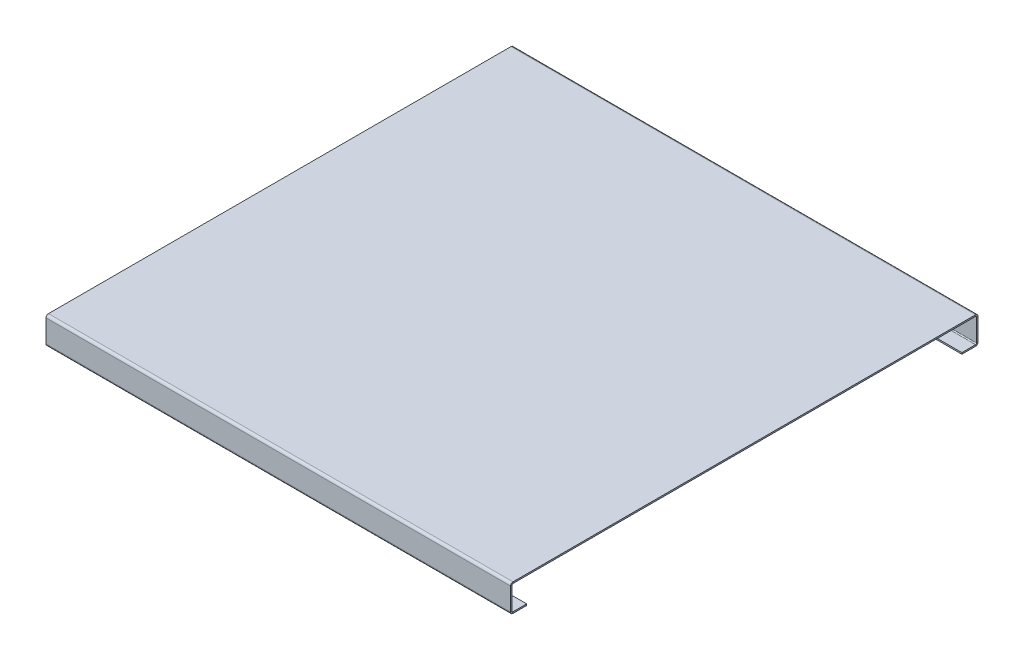
ISO-10303-21;
HEADER;
FILE_DESCRIPTION(('STEP AP214'),'2;1');
FILE_NAME('part.step','',(''),(''),'','','');
FILE_SCHEMA(('AUTOMOTIVE_DESIGN { 1 0 10303 214 1 1 1 1 }'));
ENDSEC;
DATA;
#1=APPLICATION_CONTEXT('core data for automotive mechanical design processes');
#2=APPLICATION_PROTOCOL_DEFINITION('international standard','automotive_design',2000,#1);
#3=PRODUCT_CONTEXT('',#1,'mechanical');
#4=PRODUCT('Part','Part','',(#3));
#5=PRODUCT_RELATED_PRODUCT_CATEGORY('part','',(#4));
#6=PRODUCT_DEFINITION_FORMATION('','',#4);
#7=PRODUCT_DEFINITION_CONTEXT('part definition',#1,'design');
#8=PRODUCT_DEFINITION('design','',#6,#7);
#9=PRODUCT_DEFINITION_SHAPE('','',#8);
#10=(LENGTH_UNIT() NAMED_UNIT(*) SI_UNIT(.MILLI.,.METRE.));
#11=(NAMED_UNIT(*) PLANE_ANGLE_UNIT() SI_UNIT($,.RADIAN.));
#12=(NAMED_UNIT(*) SI_UNIT($,.STERADIAN.) SOLID_ANGLE_UNIT());
#13=UNCERTAINTY_MEASURE_WITH_UNIT(LENGTH_MEASURE(1.E-05),#10,'distance_accuracy_value','');
#14=(GEOMETRIC_REPRESENTATION_CONTEXT(3) GLOBAL_UNCERTAINTY_ASSIGNED_CONTEXT((#13)) GLOBAL_UNIT_ASSIGNED_CONTEXT((#10,
#11,#12)) REPRESENTATION_CONTEXT('',''));
#15=CARTESIAN_POINT('',(0.,0.,0.));
#16=DIRECTION('',(0.,0.,1.));
#17=DIRECTION('',(1.,0.,0.));
#18=AXIS2_PLACEMENT_3D('',#15,#16,#17);
#19=CARTESIAN_POINT('',(950.,-48.,-950.));
#20=DIRECTION('',(1.,0.,0.));
#21=DIRECTION('',(0.,0.,-1.));
#22=AXIS2_PLACEMENT_3D('',#19,#20,#21);
#23=PLANE('',#22);
#24=DIRECTION('',(0.,0.,-1.));
#25=VECTOR('',#24,1.);
#26=CARTESIAN_POINT('',(950.,-48.,-950.));
#27=LINE('',#26,#25);
#28=CARTESIAN_POINT('',(950.,-48.,-950.));
#29=VERTEX_POINT('',#28);
#30=CARTESIAN_POINT('',(950.,-48.,-953.));
#31=VERTEX_POINT('',#30);
#32=EDGE_CURVE('E11',#29,#31,#27,.T.);
#33=ORIENTED_EDGE('',*,*,#32,.F.);
#34=CARTESIAN_POINT('',(950.,-48.,-948.));
#35=DIRECTION('',(-1.,0.,0.));
#36=DIRECTION('',(0.,0.,1.));
#37=AXIS2_PLACEMENT_3D('',#34,#35,#36);
#38=CIRCLE('',#37,2.);
#39=CARTESIAN_POINT('',(950.,-50.,-948.));
#40=VERTEX_POINT('',#39);
#41=EDGE_CURVE('E364',#40,#29,#38,.F.);
#42=ORIENTED_EDGE('',*,*,#41,.F.);
#43=DIRECTION('',(0.,1.,0.));
#44=VECTOR('',#43,1.);
#45=CARTESIAN_POINT('',(950.,-53.,-948.));
#46=LINE('',#45,#44);
#47=CARTESIAN_POINT('',(950.,-53.,-948.));
#48=VERTEX_POINT('',#47);
#49=EDGE_CURVE('E43',#48,#40,#46,.T.);
#50=ORIENTED_EDGE('',*,*,#49,.F.);
#51=CARTESIAN_POINT('',(950.,-48.,-948.));
#52=DIRECTION('',(1.,0.,0.));
#53=DIRECTION('',(0.,0.,-1.));
#54=AXIS2_PLACEMENT_3D('',#51,#52,#53);
#55=CIRCLE('',#54,5.);
#56=EDGE_CURVE('E377',#48,#31,#55,.T.);
#57=ORIENTED_EDGE('',*,*,#56,.T.);
#58=EDGE_LOOP('',(#33,#42,#50,#57));
#59=FACE_BOUND('',#58,.T.);
#60=ADVANCED_FACE('F35',(#59),#23,.T.);
#61=CARTESIAN_POINT('',(950.,-53.,-948.));
#62=DIRECTION('',(1.,0.,0.));
#63=DIRECTION('',(0.,0.,-1.));
#64=AXIS2_PLACEMENT_3D('',#61,#62,#63);
#65=PLANE('',#64);
#66=DIRECTION('',(0.,1.,0.));
#67=VECTOR('',#66,1.);
#68=CARTESIAN_POINT('',(950.,0.,-950.));
#69=LINE('',#68,#67);
#70=CARTESIAN_POINT('',(950.,-2.,-950.));
#71=VERTEX_POINT('',#70);
#72=EDGE_CURVE('E368',#29,#71,#69,.T.);
#73=ORIENTED_EDGE('',*,*,#72,.F.);
#74=ORIENTED_EDGE('',*,*,#32,.T.);
#75=DIRECTION('',(0.,1.,0.));
#76=VECTOR('',#75,1.);
#77=CARTESIAN_POINT('',(950.,0.,-953.));
#78=LINE('',#77,#76);
#79=CARTESIAN_POINT('',(950.,-2.,-953.));
#80=VERTEX_POINT('',#79);
#81=EDGE_CURVE('E379',#31,#80,#78,.T.);
#82=ORIENTED_EDGE('',*,*,#81,.T.);
#83=DIRECTION('',(0.,0.,1.));
#84=VECTOR('',#83,1.);
#85=CARTESIAN_POINT('',(950.,-2.,-953.));
#86=LINE('',#85,#84);
#87=EDGE_CURVE('E338',#80,#71,#86,.T.);
#88=ORIENTED_EDGE('',*,*,#87,.T.);
#89=EDGE_LOOP('',(#73,#74,#82,#88));
#90=FACE_BOUND('',#89,.T.);
#91=ADVANCED_FACE('F448',(#90),#65,.T.);
#92=CARTESIAN_POINT('',(0.,-50.,-948.));
#93=DIRECTION('',(-1.,0.,0.));
#94=DIRECTION('',(0.,0.,1.));
#95=AXIS2_PLACEMENT_3D('',#92,#93,#94);
#96=PLANE('',#95);
#97=DIRECTION('',(0.,-1.,0.));
#98=VECTOR('',#97,1.);
#99=CARTESIAN_POINT('',(0.,-50.,-948.));
#100=LINE('',#99,#98);
#101=CARTESIAN_POINT('',(0.,-50.,-948.));
#102=VERTEX_POINT('',#101);
#103=CARTESIAN_POINT('',(0.,-53.,-948.));
#104=VERTEX_POINT('',#103);
#105=EDGE_CURVE('E344',#102,#104,#100,.T.);
#106=ORIENTED_EDGE('',*,*,#105,.F.);
#107=CARTESIAN_POINT('',(0.,-48.,-948.));
#108=DIRECTION('',(-1.,0.,0.));
#109=DIRECTION('',(0.,0.,1.));
#110=AXIS2_PLACEMENT_3D('',#107,#108,#109);
#111=CIRCLE('',#110,2.);
#112=CARTESIAN_POINT('',(0.,-48.,-950.));
#113=VERTEX_POINT('',#112);
#114=EDGE_CURVE('E248',#102,#113,#111,.F.);
#115=ORIENTED_EDGE('',*,*,#114,.T.);
#116=DIRECTION('',(0.,0.,1.));
#117=VECTOR('',#116,1.);
#118=CARTESIAN_POINT('',(0.,-48.,-953.));
#119=LINE('',#118,#117);
#120=CARTESIAN_POINT('',(0.,-48.,-953.));
#121=VERTEX_POINT('',#120);
#122=EDGE_CURVE('E342',#121,#113,#119,.T.);
#123=ORIENTED_EDGE('',*,*,#122,.F.);
#124=CARTESIAN_POINT('',(0.,-48.,-948.));
#125=DIRECTION('',(1.,0.,0.));
#126=DIRECTION('',(0.,0.,-1.));
#127=AXIS2_PLACEMENT_3D('',#124,#125,#126);
#128=CIRCLE('',#127,5.);
#129=EDGE_CURVE('E260',#104,#121,#128,.T.);
#130=ORIENTED_EDGE('',*,*,#129,.F.);
#131=EDGE_LOOP('',(#106,#115,#123,#130));
#132=FACE_BOUND('',#131,.T.);
#133=ADVANCED_FACE('F490',(#132),#96,.T.);
#134=CARTESIAN_POINT('',(0.,-48.,-953.));
#135=DIRECTION('',(-1.,0.,0.));
#136=DIRECTION('',(0.,0.,1.));
#137=AXIS2_PLACEMENT_3D('',#134,#135,#136);
#138=PLANE('',#137);
#139=DIRECTION('',(0.,0.,-1.));
#140=VECTOR('',#139,1.);
#141=CARTESIAN_POINT('',(0.,-50.,-950.));
#142=LINE('',#141,#140);
#143=CARTESIAN_POINT('',(0.,-50.,-920.));
#144=VERTEX_POINT('',#143);
#145=EDGE_CURVE('E251',#144,#102,#142,.T.);
#146=ORIENTED_EDGE('',*,*,#145,.T.);
#147=ORIENTED_EDGE('',*,*,#105,.T.);
#148=DIRECTION('',(0.,0.,-1.));
#149=VECTOR('',#148,1.);
#150=CARTESIAN_POINT('',(0.,-53.,-950.));
#151=LINE('',#150,#149);
#152=CARTESIAN_POINT('',(0.,-53.,-920.));
#153=VERTEX_POINT('',#152);
#154=EDGE_CURVE('E257',#153,#104,#151,.T.);
#155=ORIENTED_EDGE('',*,*,#154,.F.);
#156=DIRECTION('',(0.,1.,0.));
#157=VECTOR('',#156,1.);
#158=CARTESIAN_POINT('',(0.,-53.,-920.));
#159=LINE('',#158,#157);
#160=EDGE_CURVE('E254',#153,#144,#159,.T.);
#161=ORIENTED_EDGE('',*,*,#160,.T.);
#162=EDGE_LOOP('',(#146,#147,#155,#161));
#163=FACE_BOUND('',#162,.T.);
#164=ADVANCED_FACE('F494',(#163),#138,.T.);
#165=CARTESIAN_POINT('',(950.,0.,-948.));
#166=DIRECTION('',(1.,0.,0.));
#167=DIRECTION('',(0.,0.,-1.));
#168=AXIS2_PLACEMENT_3D('',#165,#166,#167);
#169=PLANE('',#168);
#170=DIRECTION('',(0.,1.,0.));
#171=VECTOR('',#170,1.);
#172=CARTESIAN_POINT('',(950.,0.,-948.));
#173=LINE('',#172,#171);
#174=CARTESIAN_POINT('',(950.,0.,-948.));
#175=VERTEX_POINT('',#174);
#176=CARTESIAN_POINT('',(950.,3.,-948.));
#177=VERTEX_POINT('',#176);
#178=EDGE_CURVE('E340',#175,#177,#173,.T.);
#179=ORIENTED_EDGE('',*,*,#178,.F.);
#180=CARTESIAN_POINT('',(950.,-2.,-948.));
#181=DIRECTION('',(-1.,0.,0.));
#182=DIRECTION('',(0.,0.,1.));
#183=AXIS2_PLACEMENT_3D('',#180,#181,#182);
#184=CIRCLE('',#183,2.);
#185=EDGE_CURVE('E438',#71,#175,#184,.F.);
#186=ORIENTED_EDGE('',*,*,#185,.F.);
#187=ORIENTED_EDGE('',*,*,#87,.F.);
#188=CARTESIAN_POINT('',(950.,-2.,-948.));
#189=DIRECTION('',(1.,0.,0.));
#190=DIRECTION('',(0.,0.,-1.));
#191=AXIS2_PLACEMENT_3D('',#188,#189,#190);
#192=CIRCLE('',#191,5.);
#193=EDGE_CURVE('E382',#80,#177,#192,.T.);
#194=ORIENTED_EDGE('',*,*,#193,.T.);
#195=EDGE_LOOP('',(#179,#186,#187,#194));
#196=FACE_BOUND('',#195,.T.);
#197=ADVANCED_FACE('F455',(#196),#169,.T.);
#198=CARTESIAN_POINT('',(950.,-2.,-953.));
#199=DIRECTION('',(1.,0.,0.));
#200=DIRECTION('',(0.,0.,-1.));
#201=AXIS2_PLACEMENT_3D('',#198,#199,#200);
#202=PLANE('',#201);
#203=DIRECTION('',(0.,0.,1.));
#204=VECTOR('',#203,1.);
#205=CARTESIAN_POINT('',(950.,0.,0.));
#206=LINE('',#205,#204);
#207=CARTESIAN_POINT('',(950.,0.,-2.));
#208=VERTEX_POINT('',#207);
#209=EDGE_CURVE('E435',#175,#208,#206,.T.);
#210=ORIENTED_EDGE('',*,*,#209,.F.);
#211=ORIENTED_EDGE('',*,*,#178,.T.);
#212=DIRECTION('',(0.,0.,-1.));
#213=VECTOR('',#212,1.);
#214=CARTESIAN_POINT('',(950.,3.,0.));
#215=LINE('',#214,#213);
#216=CARTESIAN_POINT('',(950.,3.,-2.));
#217=VERTEX_POINT('',#216);
#218=EDGE_CURVE('E202',#177,#217,#215,.F.);
#219=ORIENTED_EDGE('',*,*,#218,.T.);
#220=DIRECTION('',(0.,-1.,0.));
#221=VECTOR('',#220,1.);
#222=CARTESIAN_POINT('',(950.,3.,-2.));
#223=LINE('',#222,#221);
#224=EDGE_CURVE('E193',#217,#208,#223,.T.);
#225=ORIENTED_EDGE('',*,*,#224,.T.);
#226=EDGE_LOOP('',(#210,#211,#219,#225));
#227=FACE_BOUND('',#226,.T.);
#228=ADVANCED_FACE('F388',(#227),#202,.T.);
#229=CARTESIAN_POINT('',(0.,-2.,-950.));
#230=DIRECTION('',(-1.,0.,0.));
#231=DIRECTION('',(0.,0.,1.));
#232=AXIS2_PLACEMENT_3D('',#229,#230,#231);
#233=PLANE('',#232);
#234=DIRECTION('',(0.,0.,-1.));
#235=VECTOR('',#234,1.);
#236=CARTESIAN_POINT('',(0.,-2.,-950.));
#237=LINE('',#236,#235);
#238=CARTESIAN_POINT('',(0.,-2.,-950.));
#239=VERTEX_POINT('',#238);
#240=CARTESIAN_POINT('',(0.,-2.,-953.));
#241=VERTEX_POINT('',#240);
#242=EDGE_CURVE('E336',#239,#241,#237,.T.);
#243=ORIENTED_EDGE('',*,*,#242,.F.);
#244=CARTESIAN_POINT('',(0.,-2.,-948.));
#245=DIRECTION('',(-1.,0.,0.));
#246=DIRECTION('',(0.,0.,1.));
#247=AXIS2_PLACEMENT_3D('',#244,#245,#246);
#248=CIRCLE('',#247,2.);
#249=CARTESIAN_POINT('',(0.,0.,-948.));
#250=VERTEX_POINT('',#249);
#251=EDGE_CURVE('E242',#239,#250,#248,.F.);
#252=ORIENTED_EDGE('',*,*,#251,.T.);
#253=DIRECTION('',(0.,-1.,0.));
#254=VECTOR('',#253,1.);
#255=CARTESIAN_POINT('',(0.,3.,-948.));
#256=LINE('',#255,#254);
#257=CARTESIAN_POINT('',(0.,3.,-948.));
#258=VERTEX_POINT('',#257);
#259=EDGE_CURVE('E192',#258,#250,#256,.T.);
#260=ORIENTED_EDGE('',*,*,#259,.F.);
#261=CARTESIAN_POINT('',(0.,-2.,-948.));
#262=DIRECTION('',(1.,0.,0.));
#263=DIRECTION('',(0.,0.,-1.));
#264=AXIS2_PLACEMENT_3D('',#261,#262,#263);
#265=CIRCLE('',#264,5.);
#266=EDGE_CURVE('E266',#241,#258,#265,.T.);
#267=ORIENTED_EDGE('',*,*,#266,.F.);
#268=EDGE_LOOP('',(#243,#252,#260,#267));
#269=FACE_BOUND('',#268,.T.);
#270=ADVANCED_FACE('F464',(#269),#233,.T.);
#271=CARTESIAN_POINT('',(0.,3.,-948.));
#272=DIRECTION('',(-1.,0.,0.));
#273=DIRECTION('',(0.,0.,1.));
#274=AXIS2_PLACEMENT_3D('',#271,#272,#273);
#275=PLANE('',#274);
#276=DIRECTION('',(0.,1.,0.));
#277=VECTOR('',#276,1.);
#278=CARTESIAN_POINT('',(0.,0.,-950.));
#279=LINE('',#278,#277);
#280=EDGE_CURVE('E245',#113,#239,#279,.T.);
#281=ORIENTED_EDGE('',*,*,#280,.T.);
#282=ORIENTED_EDGE('',*,*,#242,.T.);
#283=DIRECTION('',(0.,1.,0.));
#284=VECTOR('',#283,1.);
#285=CARTESIAN_POINT('',(0.,0.,-953.));
#286=LINE('',#285,#284);
#287=EDGE_CURVE('E263',#121,#241,#286,.T.);
#288=ORIENTED_EDGE('',*,*,#287,.F.);
#289=ORIENTED_EDGE('',*,*,#122,.T.);
#290=EDGE_LOOP('',(#281,#282,#288,#289));
#291=FACE_BOUND('',#290,.T.);
#292=ADVANCED_FACE('F468',(#291),#275,.T.);
#293=CARTESIAN_POINT('',(950.,-2.,0.));
#294=DIRECTION('',(1.,0.,0.));
#295=DIRECTION('',(0.,0.,-1.));
#296=AXIS2_PLACEMENT_3D('',#293,#294,#295);
#297=PLANE('',#296);
#298=DIRECTION('',(0.,0.,1.));
#299=VECTOR('',#298,1.);
#300=CARTESIAN_POINT('',(950.,-2.,0.));
#301=LINE('',#300,#299);
#302=CARTESIAN_POINT('',(950.,-2.,0.));
#303=VERTEX_POINT('',#302);
#304=CARTESIAN_POINT('',(950.,-2.,3.));
#305=VERTEX_POINT('',#304);
#306=EDGE_CURVE('E180',#303,#305,#301,.T.);
#307=ORIENTED_EDGE('',*,*,#306,.F.);
#308=CARTESIAN_POINT('',(950.,-2.,-2.));
#309=DIRECTION('',(-1.,0.,0.));
#310=DIRECTION('',(0.,0.,1.));
#311=AXIS2_PLACEMENT_3D('',#308,#309,#310);
#312=CIRCLE('',#311,2.);
#313=EDGE_CURVE('E400',#208,#303,#312,.F.);
#314=ORIENTED_EDGE('',*,*,#313,.F.);
#315=ORIENTED_EDGE('',*,*,#224,.F.);
#316=CARTESIAN_POINT('',(950.,-2.,-2.));
#317=DIRECTION('',(1.,0.,0.));
#318=DIRECTION('',(0.,0.,-1.));
#319=AXIS2_PLACEMENT_3D('',#316,#317,#318);
#320=CIRCLE('',#319,5.);
#321=EDGE_CURVE('E196',#217,#305,#320,.T.);
#322=ORIENTED_EDGE('',*,*,#321,.T.);
#323=EDGE_LOOP('',(#307,#314,#315,#322));
#324=FACE_BOUND('',#323,.T.);
#325=ADVANCED_FACE('F198',(#324),#297,.T.);
#326=CARTESIAN_POINT('',(950.,3.,-2.));
#327=DIRECTION('',(1.,0.,0.));
#328=DIRECTION('',(0.,0.,-1.));
#329=AXIS2_PLACEMENT_3D('',#326,#327,#328);
#330=PLANE('',#329);
#331=DIRECTION('',(0.,-1.,0.));
#332=VECTOR('',#331,1.);
#333=CARTESIAN_POINT('',(950.,0.,0.));
#334=LINE('',#333,#332);
#335=CARTESIAN_POINT('',(950.,-48.,0.));
#336=VERTEX_POINT('',#335);
#337=EDGE_CURVE('E187',#303,#336,#334,.T.);
#338=ORIENTED_EDGE('',*,*,#337,.F.);
#339=ORIENTED_EDGE('',*,*,#306,.T.);
#340=DIRECTION('',(0.,-1.,0.));
#341=VECTOR('',#340,1.);
#342=CARTESIAN_POINT('',(950.,0.,3.));
#343=LINE('',#342,#341);
#344=CARTESIAN_POINT('',(950.,-48.,2.99999999999999));
#345=VERTEX_POINT('',#344);
#346=EDGE_CURVE('E184',#305,#345,#343,.T.);
#347=ORIENTED_EDGE('',*,*,#346,.T.);
#348=DIRECTION('',(0.,0.,-1.));
#349=VECTOR('',#348,1.);
#350=CARTESIAN_POINT('',(950.,-48.,2.99999999999999));
#351=LINE('',#350,#349);
#352=EDGE_CURVE('E327',#345,#336,#351,.T.);
#353=ORIENTED_EDGE('',*,*,#352,.T.);
#354=EDGE_LOOP('',(#338,#339,#347,#353));
#355=FACE_BOUND('',#354,.T.);
#356=ADVANCED_FACE('F182',(#355),#330,.T.);
#357=CARTESIAN_POINT('',(0.,0.,-2.));
#358=DIRECTION('',(-1.,0.,0.));
#359=DIRECTION('',(0.,0.,1.));
#360=AXIS2_PLACEMENT_3D('',#357,#358,#359);
#361=PLANE('',#360);
#362=DIRECTION('',(0.,1.,0.));
#363=VECTOR('',#362,1.);
#364=CARTESIAN_POINT('',(0.,0.,-2.));
#365=LINE('',#364,#363);
#366=CARTESIAN_POINT('',(0.,0.,-2.));
#367=VERTEX_POINT('',#366);
#368=CARTESIAN_POINT('',(0.,3.,-2.));
#369=VERTEX_POINT('',#368);
#370=EDGE_CURVE('E332',#367,#369,#365,.T.);
#371=ORIENTED_EDGE('',*,*,#370,.F.);
#372=CARTESIAN_POINT('',(0.,-2.,-2.));
#373=DIRECTION('',(-1.,0.,0.));
#374=DIRECTION('',(0.,0.,1.));
#375=AXIS2_PLACEMENT_3D('',#372,#373,#374);
#376=CIRCLE('',#375,2.);
#377=CARTESIAN_POINT('',(0.,-2.,0.));
#378=VERTEX_POINT('',#377);
#379=EDGE_CURVE('E236',#367,#378,#376,.F.);
#380=ORIENTED_EDGE('',*,*,#379,.T.);
#381=DIRECTION('',(0.,0.,-1.));
#382=VECTOR('',#381,1.);
#383=CARTESIAN_POINT('',(0.,-2.,3.));
#384=LINE('',#383,#382);
#385=CARTESIAN_POINT('',(0.,-2.,3.));
#386=VERTEX_POINT('',#385);
#387=EDGE_CURVE('E330',#386,#378,#384,.T.);
#388=ORIENTED_EDGE('',*,*,#387,.F.);
#389=CARTESIAN_POINT('',(0.,-2.,-2.));
#390=DIRECTION('',(1.,0.,0.));
#391=DIRECTION('',(0.,0.,-1.));
#392=AXIS2_PLACEMENT_3D('',#389,#390,#391);
#393=CIRCLE('',#392,5.);
#394=EDGE_CURVE('E209',#369,#386,#393,.T.);
#395=ORIENTED_EDGE('',*,*,#394,.F.);
#396=EDGE_LOOP('',(#371,#380,#388,#395));
#397=FACE_BOUND('',#396,.T.);
#398=ADVANCED_FACE('F394',(#397),#361,.T.);
#399=CARTESIAN_POINT('',(0.,-2.,3.));
#400=DIRECTION('',(-1.,0.,0.));
#401=DIRECTION('',(0.,0.,1.));
#402=AXIS2_PLACEMENT_3D('',#399,#400,#401);
#403=PLANE('',#402);
#404=DIRECTION('',(0.,0.,1.));
#405=VECTOR('',#404,1.);
#406=CARTESIAN_POINT('',(0.,0.,0.));
#407=LINE('',#406,#405);
#408=EDGE_CURVE('E239',#250,#367,#407,.T.);
#409=ORIENTED_EDGE('',*,*,#408,.T.);
#410=ORIENTED_EDGE('',*,*,#370,.T.);
#411=DIRECTION('',(0.,0.,-1.));
#412=VECTOR('',#411,1.);
#413=CARTESIAN_POINT('',(0.,3.,0.));
#414=LINE('',#413,#412);
#415=EDGE_CURVE('E269',#258,#369,#414,.F.);
#416=ORIENTED_EDGE('',*,*,#415,.F.);
#417=ORIENTED_EDGE('',*,*,#259,.T.);
#418=EDGE_LOOP('',(#409,#410,#416,#417));
#419=FACE_BOUND('',#418,.T.);
#420=ADVANCED_FACE('F474',(#419),#403,.T.);
#421=CARTESIAN_POINT('',(950.,-50.,-2.00000000000001));
#422=DIRECTION('',(1.,0.,0.));
#423=DIRECTION('',(0.,0.,-1.));
#424=AXIS2_PLACEMENT_3D('',#421,#422,#423);
#425=PLANE('',#424);
#426=DIRECTION('',(0.,-1.,0.));
#427=VECTOR('',#426,1.);
#428=CARTESIAN_POINT('',(950.,-50.,-2.00000000000001));
#429=LINE('',#428,#427);
#430=CARTESIAN_POINT('',(950.,-50.,-2.00000000000001));
#431=VERTEX_POINT('',#430);
#432=CARTESIAN_POINT('',(950.,-53.,-2.00000000000001));
#433=VERTEX_POINT('',#432);
#434=EDGE_CURVE('E51',#431,#433,#429,.T.);
#435=ORIENTED_EDGE('',*,*,#434,.F.);
#436=CARTESIAN_POINT('',(950.,-48.,-2.00000000000001));
#437=DIRECTION('',(-1.,0.,0.));
#438=DIRECTION('',(0.,0.,1.));
#439=AXIS2_PLACEMENT_3D('',#436,#437,#438);
#440=CIRCLE('',#439,2.);
#441=EDGE_CURVE('E428',#336,#431,#440,.F.);
#442=ORIENTED_EDGE('',*,*,#441,.F.);
#443=ORIENTED_EDGE('',*,*,#352,.F.);
#444=CARTESIAN_POINT('',(950.,-48.,-2.00000000000001));
#445=DIRECTION('',(1.,0.,0.));
#446=DIRECTION('',(0.,0.,-1.));
#447=AXIS2_PLACEMENT_3D('',#444,#445,#446);
#448=CIRCLE('',#447,5.);
#449=EDGE_CURVE('E217',#345,#433,#448,.T.);
#450=ORIENTED_EDGE('',*,*,#449,.T.);
#451=EDGE_LOOP('',(#435,#442,#443,#450));
#452=FACE_BOUND('',#451,.T.);
#453=ADVANCED_FACE('F476',(#452),#425,.T.);
#454=CARTESIAN_POINT('',(950.,-48.,2.99999999999999));
#455=DIRECTION('',(1.,0.,0.));
#456=DIRECTION('',(0.,0.,-1.));
#457=AXIS2_PLACEMENT_3D('',#454,#455,#456);
#458=PLANE('',#457);
#459=DIRECTION('',(0.,0.,-1.));
#460=VECTOR('',#459,1.);
#461=CARTESIAN_POINT('',(950.,-50.,0.));
#462=LINE('',#461,#460);
#463=CARTESIAN_POINT('',(950.,-50.,-30.));
#464=VERTEX_POINT('',#463);
#465=EDGE_CURVE('E426',#431,#464,#462,.T.);
#466=ORIENTED_EDGE('',*,*,#465,.F.);
#467=ORIENTED_EDGE('',*,*,#434,.T.);
#468=DIRECTION('',(0.,0.,-1.));
#469=VECTOR('',#468,1.);
#470=CARTESIAN_POINT('',(950.,-53.,0.));
#471=LINE('',#470,#469);
#472=CARTESIAN_POINT('',(950.,-53.,-30.));
#473=VERTEX_POINT('',#472);
#474=EDGE_CURVE('E129',#433,#473,#471,.T.);
#475=ORIENTED_EDGE('',*,*,#474,.T.);
#476=DIRECTION('',(0.,-1.,0.));
#477=VECTOR('',#476,1.);
#478=CARTESIAN_POINT('',(950.,-50.,-30.));
#479=LINE('',#478,#477);
#480=EDGE_CURVE('E424',#464,#473,#479,.T.);
#481=ORIENTED_EDGE('',*,*,#480,.F.);
#482=EDGE_LOOP('',(#466,#467,#475,#481));
#483=FACE_BOUND('',#482,.T.);
#484=ADVANCED_FACE('F482',(#483),#458,.T.);
#485=CARTESIAN_POINT('',(0.,-48.,0.));
#486=DIRECTION('',(-1.,0.,0.));
#487=DIRECTION('',(0.,0.,1.));
#488=AXIS2_PLACEMENT_3D('',#485,#486,#487);
#489=PLANE('',#488);
#490=DIRECTION('',(0.,0.,1.));
#491=VECTOR('',#490,1.);
#492=CARTESIAN_POINT('',(0.,-48.,0.));
#493=LINE('',#492,#491);
#494=CARTESIAN_POINT('',(0.,-48.,0.));
#495=VERTEX_POINT('',#494);
#496=CARTESIAN_POINT('',(0.,-48.,2.99999999999999));
#497=VERTEX_POINT('',#496);
#498=EDGE_CURVE('E116',#495,#497,#493,.T.);
#499=ORIENTED_EDGE('',*,*,#498,.F.);
#500=CARTESIAN_POINT('',(0.,-48.,-2.00000000000001));
#501=DIRECTION('',(-1.,0.,0.));
#502=DIRECTION('',(0.,0.,1.));
#503=AXIS2_PLACEMENT_3D('',#500,#501,#502);
#504=CIRCLE('',#503,2.);
#505=CARTESIAN_POINT('',(0.,-50.,-2.00000000000001));
#506=VERTEX_POINT('',#505);
#507=EDGE_CURVE('E232',#495,#506,#504,.F.);
#508=ORIENTED_EDGE('',*,*,#507,.T.);
#509=DIRECTION('',(0.,1.,0.));
#510=VECTOR('',#509,1.);
#511=CARTESIAN_POINT('',(0.,-53.,-2.00000000000001));
#512=LINE('',#511,#510);
#513=CARTESIAN_POINT('',(0.,-53.,-2.00000000000001));
#514=VERTEX_POINT('',#513);
#515=EDGE_CURVE('E123',#514,#506,#512,.T.);
#516=ORIENTED_EDGE('',*,*,#515,.F.);
#517=CARTESIAN_POINT('',(0.,-48.,-2.00000000000001));
#518=DIRECTION('',(1.,0.,0.));
#519=DIRECTION('',(0.,0.,-1.));
#520=AXIS2_PLACEMENT_3D('',#517,#518,#519);
#521=CIRCLE('',#520,5.);
#522=EDGE_CURVE('E275',#497,#514,#521,.T.);
#523=ORIENTED_EDGE('',*,*,#522,.F.);
#524=EDGE_LOOP('',(#499,#508,#516,#523));
#525=FACE_BOUND('',#524,.T.);
#526=ADVANCED_FACE('F411',(#525),#489,.T.);
#527=CARTESIAN_POINT('',(0.,-53.,-2.00000000000001));
#528=DIRECTION('',(-1.,0.,0.));
#529=DIRECTION('',(0.,0.,1.));
#530=AXIS2_PLACEMENT_3D('',#527,#528,#529);
#531=PLANE('',#530);
#532=DIRECTION('',(0.,-1.,0.));
#533=VECTOR('',#532,1.);
#534=CARTESIAN_POINT('',(0.,0.,0.));
#535=LINE('',#534,#533);
#536=EDGE_CURVE('E234',#378,#495,#535,.T.);
#537=ORIENTED_EDGE('',*,*,#536,.T.);
#538=ORIENTED_EDGE('',*,*,#498,.T.);
#539=DIRECTION('',(0.,-1.,0.));
#540=VECTOR('',#539,1.);
#541=CARTESIAN_POINT('',(0.,0.,3.));
#542=LINE('',#541,#540);
#543=EDGE_CURVE('E273',#386,#497,#542,.T.);
#544=ORIENTED_EDGE('',*,*,#543,.F.);
#545=ORIENTED_EDGE('',*,*,#387,.T.);
#546=EDGE_LOOP('',(#537,#538,#544,#545));
#547=FACE_BOUND('',#546,.T.);
#548=ADVANCED_FACE('F396',(#547),#531,.T.);
#549=CARTESIAN_POINT('',(950.,-53.,0.));
#550=DIRECTION('',(0.,1.,0.));
#551=DIRECTION('',(0.,0.,1.));
#552=AXIS2_PLACEMENT_3D('',#549,#550,#551);
#553=PLANE('',#552);
#554=DIRECTION('',(0.,0.,-1.));
#555=VECTOR('',#554,1.);
#556=CARTESIAN_POINT('',(0.,-53.,0.));
#557=LINE('',#556,#555);
#558=CARTESIAN_POINT('',(0.,-53.,-30.));
#559=VERTEX_POINT('',#558);
#560=EDGE_CURVE('E223',#514,#559,#557,.T.);
#561=ORIENTED_EDGE('',*,*,#560,.T.);
#562=DIRECTION('',(-1.,0.,0.));
#563=VECTOR('',#562,1.);
#564=CARTESIAN_POINT('',(950.,-53.,-30.));
#565=LINE('',#564,#563);
#566=EDGE_CURVE('E323',#473,#559,#565,.T.);
#567=ORIENTED_EDGE('',*,*,#566,.F.);
#568=ORIENTED_EDGE('',*,*,#474,.F.);
#569=DIRECTION('',(-1.,0.,0.));
#570=VECTOR('',#569,1.);
#571=CARTESIAN_POINT('',(950.,-53.,-2.00000000000001));
#572=LINE('',#571,#570);
#573=EDGE_CURVE('E219',#433,#514,#572,.T.);
#574=ORIENTED_EDGE('',*,*,#573,.T.);
#575=EDGE_LOOP('',(#561,#567,#568,#574));
#576=FACE_BOUND('',#575,.T.);
#577=ADVANCED_FACE('F417',(#576),#553,.F.);
#578=CARTESIAN_POINT('',(950.,-50.,-30.));
#579=DIRECTION('',(0.,0.,-1.));
#580=DIRECTION('',(-1.,0.,0.));
#581=AXIS2_PLACEMENT_3D('',#578,#579,#580);
#582=PLANE('',#581);
#583=DIRECTION('',(0.,-1.,0.));
#584=VECTOR('',#583,1.);
#585=CARTESIAN_POINT('',(0.,-50.,-30.));
#586=LINE('',#585,#584);
#587=CARTESIAN_POINT('',(0.,-50.,-30.));
#588=VERTEX_POINT('',#587);
#589=EDGE_CURVE('E226',#588,#559,#586,.T.);
#590=ORIENTED_EDGE('',*,*,#589,.F.);
#591=DIRECTION('',(-1.,0.,0.));
#592=VECTOR('',#591,1.);
#593=CARTESIAN_POINT('',(950.,-50.,-30.));
#594=LINE('',#593,#592);
#595=EDGE_CURVE('E321',#464,#588,#594,.T.);
#596=ORIENTED_EDGE('',*,*,#595,.F.);
#597=ORIENTED_EDGE('',*,*,#480,.T.);
#598=ORIENTED_EDGE('',*,*,#566,.T.);
#599=EDGE_LOOP('',(#590,#596,#597,#598));
#600=FACE_BOUND('',#599,.T.);
#601=ADVANCED_FACE('F422',(#600),#582,.T.);
#602=CARTESIAN_POINT('',(950.,-50.,0.));
#603=DIRECTION('',(0.,1.,0.));
#604=DIRECTION('',(0.,0.,1.));
#605=AXIS2_PLACEMENT_3D('',#602,#603,#604);
#606=PLANE('',#605);
#607=DIRECTION('',(0.,0.,-1.));
#608=VECTOR('',#607,1.);
#609=CARTESIAN_POINT('',(0.,-50.,0.));
#610=LINE('',#609,#608);
#611=EDGE_CURVE('E229',#506,#588,#610,.T.);
#612=ORIENTED_EDGE('',*,*,#611,.F.);
#613=DIRECTION('',(-1.,0.,0.));
#614=VECTOR('',#613,1.);
#615=CARTESIAN_POINT('',(950.,-50.,-2.00000000000001));
#616=LINE('',#615,#614);
#617=EDGE_CURVE('E318',#431,#506,#616,.T.);
#618=ORIENTED_EDGE('',*,*,#617,.F.);
#619=ORIENTED_EDGE('',*,*,#465,.T.);
#620=ORIENTED_EDGE('',*,*,#595,.T.);
#621=EDGE_LOOP('',(#612,#618,#619,#620));
#622=FACE_BOUND('',#621,.T.);
#623=ADVANCED_FACE('F578',(#622),#606,.T.);
#624=CARTESIAN_POINT('',(950.,-48.,-2.00000000000001));
#625=DIRECTION('',(-1.,0.,0.));
#626=DIRECTION('',(0.,0.,1.));
#627=AXIS2_PLACEMENT_3D('',#624,#625,#626);
#628=CYLINDRICAL_SURFACE('',#627,2.);
#629=ORIENTED_EDGE('',*,*,#507,.F.);
#630=DIRECTION('',(-1.,0.,0.));
#631=VECTOR('',#630,1.);
#632=CARTESIAN_POINT('',(950.,-48.,0.));
#633=LINE('',#632,#631);
#634=EDGE_CURVE('E315',#336,#495,#633,.T.);
#635=ORIENTED_EDGE('',*,*,#634,.F.);
#636=ORIENTED_EDGE('',*,*,#441,.T.);
#637=ORIENTED_EDGE('',*,*,#617,.T.);
#638=EDGE_LOOP('',(#629,#635,#636,#637));
#639=FACE_BOUND('',#638,.T.);
#640=ADVANCED_FACE('F408',(#639),#628,.F.);
#641=CARTESIAN_POINT('',(950.,0.,0.));
#642=DIRECTION('',(0.,0.,-1.));
#643=DIRECTION('',(0.,1.,0.));
#644=AXIS2_PLACEMENT_3D('',#641,#642,#643);
#645=PLANE('',#644);
#646=ORIENTED_EDGE('',*,*,#536,.F.);
#647=DIRECTION('',(-1.,0.,0.));
#648=VECTOR('',#647,1.);
#649=CARTESIAN_POINT('',(950.,-2.,0.));
#650=LINE('',#649,#648);
#651=EDGE_CURVE('E312',#303,#378,#650,.T.);
#652=ORIENTED_EDGE('',*,*,#651,.F.);
#653=ORIENTED_EDGE('',*,*,#337,.T.);
#654=ORIENTED_EDGE('',*,*,#634,.T.);
#655=EDGE_LOOP('',(#646,#652,#653,#654));
#656=FACE_BOUND('',#655,.T.);
#657=ADVANCED_FACE('F402',(#656),#645,.T.);
#658=CARTESIAN_POINT('',(950.,-2.,-2.));
#659=DIRECTION('',(-1.,0.,0.));
#660=DIRECTION('',(0.,0.,1.));
#661=AXIS2_PLACEMENT_3D('',#658,#659,#660);
#662=CYLINDRICAL_SURFACE('',#661,2.);
#663=ORIENTED_EDGE('',*,*,#379,.F.);
#664=DIRECTION('',(-1.,0.,0.));
#665=VECTOR('',#664,1.);
#666=CARTESIAN_POINT('',(950.,0.,-2.));
#667=LINE('',#666,#665);
#668=EDGE_CURVE('E309',#208,#367,#667,.T.);
#669=ORIENTED_EDGE('',*,*,#668,.F.);
#670=ORIENTED_EDGE('',*,*,#313,.T.);
#671=ORIENTED_EDGE('',*,*,#651,.T.);
#672=EDGE_LOOP('',(#663,#669,#670,#671));
#673=FACE_BOUND('',#672,.T.);
#674=ADVANCED_FACE('F399',(#673),#662,.F.);
#675=CARTESIAN_POINT('',(950.,0.,0.));
#676=DIRECTION('',(0.,-1.,0.));
#677=DIRECTION('',(0.,0.,-1.));
#678=AXIS2_PLACEMENT_3D('',#675,#676,#677);
#679=PLANE('',#678);
#680=ORIENTED_EDGE('',*,*,#408,.F.);
#681=DIRECTION('',(-1.,0.,0.));
#682=VECTOR('',#681,1.);
#683=CARTESIAN_POINT('',(950.,0.,-948.));
#684=LINE('',#683,#682);
#685=EDGE_CURVE('E306',#175,#250,#684,.T.);
#686=ORIENTED_EDGE('',*,*,#685,.F.);
#687=ORIENTED_EDGE('',*,*,#209,.T.);
#688=ORIENTED_EDGE('',*,*,#668,.T.);
#689=EDGE_LOOP('',(#680,#686,#687,#688));
#690=FACE_BOUND('',#689,.T.);
#691=ADVANCED_FACE('F461',(#690),#679,.T.);
#692=CARTESIAN_POINT('',(950.,-2.,-948.));
#693=DIRECTION('',(-1.,0.,0.));
#694=DIRECTION('',(0.,0.,1.));
#695=AXIS2_PLACEMENT_3D('',#692,#693,#694);
#696=CYLINDRICAL_SURFACE('',#695,2.);
#697=ORIENTED_EDGE('',*,*,#251,.F.);
#698=DIRECTION('',(-1.,0.,0.));
#699=VECTOR('',#698,1.);
#700=CARTESIAN_POINT('',(950.,-2.,-950.));
#701=LINE('',#700,#699);
#702=EDGE_CURVE('E303',#71,#239,#701,.T.);
#703=ORIENTED_EDGE('',*,*,#702,.F.);
#704=ORIENTED_EDGE('',*,*,#185,.T.);
#705=ORIENTED_EDGE('',*,*,#685,.T.);
#706=EDGE_LOOP('',(#697,#703,#704,#705));
#707=FACE_BOUND('',#706,.T.);
#708=ADVANCED_FACE('F454',(#707),#696,.F.);
#709=CARTESIAN_POINT('',(950.,0.,-950.));
#710=DIRECTION('',(0.,0.,1.));
#711=DIRECTION('',(1.,0.,0.));
#712=AXIS2_PLACEMENT_3D('',#709,#710,#711);
#713=PLANE('',#712);
#714=ORIENTED_EDGE('',*,*,#280,.F.);
#715=DIRECTION('',(-1.,0.,0.));
#716=VECTOR('',#715,1.);
#717=CARTESIAN_POINT('',(950.,-48.,-950.));
#718=LINE('',#717,#716);
#719=EDGE_CURVE('E300',#29,#113,#718,.T.);
#720=ORIENTED_EDGE('',*,*,#719,.F.);
#721=ORIENTED_EDGE('',*,*,#72,.T.);
#722=ORIENTED_EDGE('',*,*,#702,.T.);
#723=EDGE_LOOP('',(#714,#720,#721,#722));
#724=FACE_BOUND('',#723,.T.);
#725=ADVANCED_FACE('F444',(#724),#713,.T.);
#726=CARTESIAN_POINT('',(950.,-48.,-948.));
#727=DIRECTION('',(-1.,0.,0.));
#728=DIRECTION('',(0.,0.,1.));
#729=AXIS2_PLACEMENT_3D('',#726,#727,#728);
#730=CYLINDRICAL_SURFACE('',#729,2.);
#731=ORIENTED_EDGE('',*,*,#114,.F.);
#732=DIRECTION('',(-1.,0.,0.));
#733=VECTOR('',#732,1.);
#734=CARTESIAN_POINT('',(950.,-50.,-948.));
#735=LINE('',#734,#733);
#736=EDGE_CURVE('E297',#40,#102,#735,.T.);
#737=ORIENTED_EDGE('',*,*,#736,.F.);
#738=ORIENTED_EDGE('',*,*,#41,.T.);
#739=ORIENTED_EDGE('',*,*,#719,.T.);
#740=EDGE_LOOP('',(#731,#737,#738,#739));
#741=FACE_BOUND('',#740,.T.);
#742=ADVANCED_FACE('F363',(#741),#730,.F.);
#743=CARTESIAN_POINT('',(950.,-50.,-950.));
#744=DIRECTION('',(0.,1.,0.));
#745=DIRECTION('',(0.,0.,1.));
#746=AXIS2_PLACEMENT_3D('',#743,#744,#745);
#747=PLANE('',#746);
#748=ORIENTED_EDGE('',*,*,#145,.F.);
#749=DIRECTION('',(-1.,0.,0.));
#750=VECTOR('',#749,1.);
#751=CARTESIAN_POINT('',(950.,-50.,-920.));
#752=LINE('',#751,#750);
#753=CARTESIAN_POINT('',(950.,-50.,-920.));
#754=VERTEX_POINT('',#753);
#755=EDGE_CURVE('E295',#754,#144,#752,.T.);
#756=ORIENTED_EDGE('',*,*,#755,.F.);
#757=DIRECTION('',(0.,0.,-1.));
#758=VECTOR('',#757,1.);
#759=CARTESIAN_POINT('',(950.,-50.,-950.));
#760=LINE('',#759,#758);
#761=EDGE_CURVE('E352',#754,#40,#760,.T.);
#762=ORIENTED_EDGE('',*,*,#761,.T.);
#763=ORIENTED_EDGE('',*,*,#736,.T.);
#764=EDGE_LOOP('',(#748,#756,#762,#763));
#765=FACE_BOUND('',#764,.T.);
#766=ADVANCED_FACE('F370',(#765),#747,.T.);
#767=CARTESIAN_POINT('',(950.,-53.,-920.));
#768=DIRECTION('',(0.,0.,1.));
#769=DIRECTION('',(1.,0.,0.));
#770=AXIS2_PLACEMENT_3D('',#767,#768,#769);
#771=PLANE('',#770);
#772=ORIENTED_EDGE('',*,*,#160,.F.);
#773=DIRECTION('',(-1.,0.,0.));
#774=VECTOR('',#773,1.);
#775=CARTESIAN_POINT('',(950.,-53.,-920.));
#776=LINE('',#775,#774);
#777=CARTESIAN_POINT('',(950.,-53.,-920.));
#778=VERTEX_POINT('',#777);
#779=EDGE_CURVE('E293',#778,#153,#776,.T.);
#780=ORIENTED_EDGE('',*,*,#779,.F.);
#781=DIRECTION('',(0.,1.,0.));
#782=VECTOR('',#781,1.);
#783=CARTESIAN_POINT('',(950.,-53.,-920.));
#784=LINE('',#783,#782);
#785=EDGE_CURVE('E371',#778,#754,#784,.T.);
#786=ORIENTED_EDGE('',*,*,#785,.T.);
#787=ORIENTED_EDGE('',*,*,#755,.T.);
#788=EDGE_LOOP('',(#772,#780,#786,#787));
#789=FACE_BOUND('',#788,.T.);
#790=ADVANCED_FACE('F661',(#789),#771,.T.);
#791=CARTESIAN_POINT('',(950.,-53.,-950.));
#792=DIRECTION('',(0.,1.,0.));
#793=DIRECTION('',(0.,0.,1.));
#794=AXIS2_PLACEMENT_3D('',#791,#792,#793);
#795=PLANE('',#794);
#796=ORIENTED_EDGE('',*,*,#154,.T.);
#797=DIRECTION('',(-1.,0.,0.));
#798=VECTOR('',#797,1.);
#799=CARTESIAN_POINT('',(950.,-53.,-948.));
#800=LINE('',#799,#798);
#801=EDGE_CURVE('E290',#48,#104,#800,.T.);
#802=ORIENTED_EDGE('',*,*,#801,.F.);
#803=DIRECTION('',(0.,0.,-1.));
#804=VECTOR('',#803,1.);
#805=CARTESIAN_POINT('',(950.,-53.,-950.));
#806=LINE('',#805,#804);
#807=EDGE_CURVE('E355',#778,#48,#806,.T.);
#808=ORIENTED_EDGE('',*,*,#807,.F.);
#809=ORIENTED_EDGE('',*,*,#779,.T.);
#810=EDGE_LOOP('',(#796,#802,#808,#809));
#811=FACE_BOUND('',#810,.T.);
#812=ADVANCED_FACE('F671',(#811),#795,.F.);
#813=CARTESIAN_POINT('',(950.,-48.,-948.));
#814=DIRECTION('',(-1.,0.,0.));
#815=DIRECTION('',(0.,0.,1.));
#816=AXIS2_PLACEMENT_3D('',#813,#814,#815);
#817=CYLINDRICAL_SURFACE('',#816,5.);
#818=ORIENTED_EDGE('',*,*,#129,.T.);
#819=DIRECTION('',(-1.,0.,0.));
#820=VECTOR('',#819,1.);
#821=CARTESIAN_POINT('',(950.,-48.,-953.));
#822=LINE('',#821,#820);
#823=EDGE_CURVE('E287',#31,#121,#822,.T.);
#824=ORIENTED_EDGE('',*,*,#823,.F.);
#825=ORIENTED_EDGE('',*,*,#56,.F.);
#826=ORIENTED_EDGE('',*,*,#801,.T.);
#827=EDGE_LOOP('',(#818,#824,#825,#826));
#828=FACE_BOUND('',#827,.T.);
#829=ADVANCED_FACE('F682',(#828),#817,.T.);
#830=CARTESIAN_POINT('',(950.,0.,-953.));
#831=DIRECTION('',(0.,0.,1.));
#832=DIRECTION('',(1.,0.,0.));
#833=AXIS2_PLACEMENT_3D('',#830,#831,#832);
#834=PLANE('',#833);
#835=ORIENTED_EDGE('',*,*,#287,.T.);
#836=DIRECTION('',(-1.,0.,0.));
#837=VECTOR('',#836,1.);
#838=CARTESIAN_POINT('',(950.,-2.,-953.));
#839=LINE('',#838,#837);
#840=EDGE_CURVE('E284',#80,#241,#839,.T.);
#841=ORIENTED_EDGE('',*,*,#840,.F.);
#842=ORIENTED_EDGE('',*,*,#81,.F.);
#843=ORIENTED_EDGE('',*,*,#823,.T.);
#844=EDGE_LOOP('',(#835,#841,#842,#843));
#845=FACE_BOUND('',#844,.T.);
#846=ADVANCED_FACE('F470',(#845),#834,.F.);
#847=CARTESIAN_POINT('',(950.,-2.,-948.));
#848=DIRECTION('',(-1.,0.,0.));
#849=DIRECTION('',(0.,0.,1.));
#850=AXIS2_PLACEMENT_3D('',#847,#848,#849);
#851=CYLINDRICAL_SURFACE('',#850,5.);
#852=ORIENTED_EDGE('',*,*,#266,.T.);
#853=DIRECTION('',(-1.,0.,0.));
#854=VECTOR('',#853,1.);
#855=CARTESIAN_POINT('',(950.,3.,-948.));
#856=LINE('',#855,#854);
#857=EDGE_CURVE('E281',#177,#258,#856,.T.);
#858=ORIENTED_EDGE('',*,*,#857,.F.);
#859=ORIENTED_EDGE('',*,*,#193,.F.);
#860=ORIENTED_EDGE('',*,*,#840,.T.);
#861=EDGE_LOOP('',(#852,#858,#859,#860));
#862=FACE_BOUND('',#861,.T.);
#863=ADVANCED_FACE('F473',(#862),#851,.T.);
#864=CARTESIAN_POINT('',(950.,3.,0.));
#865=DIRECTION('',(0.,-1.,0.));
#866=DIRECTION('',(0.,0.,-1.));
#867=AXIS2_PLACEMENT_3D('',#864,#865,#866);
#868=PLANE('',#867);
#869=ORIENTED_EDGE('',*,*,#415,.T.);
#870=DIRECTION('',(-1.,0.,0.));
#871=VECTOR('',#870,1.);
#872=CARTESIAN_POINT('',(950.,3.,-2.));
#873=LINE('',#872,#871);
#874=EDGE_CURVE('E211',#217,#369,#873,.T.);
#875=ORIENTED_EDGE('',*,*,#874,.F.);
#876=ORIENTED_EDGE('',*,*,#218,.F.);
#877=ORIENTED_EDGE('',*,*,#857,.T.);
#878=EDGE_LOOP('',(#869,#875,#876,#877));
#879=FACE_BOUND('',#878,.T.);
#880=ADVANCED_FACE('F391',(#879),#868,.F.);
#881=CARTESIAN_POINT('',(950.,-2.,-2.));
#882=DIRECTION('',(-1.,0.,0.));
#883=DIRECTION('',(0.,0.,1.));
#884=AXIS2_PLACEMENT_3D('',#881,#882,#883);
#885=CYLINDRICAL_SURFACE('',#884,5.);
#886=ORIENTED_EDGE('',*,*,#394,.T.);
#887=DIRECTION('',(-1.,0.,0.));
#888=VECTOR('',#887,1.);
#889=CARTESIAN_POINT('',(950.,-2.,3.));
#890=LINE('',#889,#888);
#891=EDGE_CURVE('E206',#305,#386,#890,.T.);
#892=ORIENTED_EDGE('',*,*,#891,.F.);
#893=ORIENTED_EDGE('',*,*,#321,.F.);
#894=ORIENTED_EDGE('',*,*,#874,.T.);
#895=EDGE_LOOP('',(#886,#892,#893,#894));
#896=FACE_BOUND('',#895,.T.);
#897=ADVANCED_FACE('F207',(#896),#885,.T.);
#898=CARTESIAN_POINT('',(950.,0.,3.));
#899=DIRECTION('',(0.,0.,-1.));
#900=DIRECTION('',(0.,1.,0.));
#901=AXIS2_PLACEMENT_3D('',#898,#899,#900);
#902=PLANE('',#901);
#903=ORIENTED_EDGE('',*,*,#543,.T.);
#904=DIRECTION('',(-1.,0.,0.));
#905=VECTOR('',#904,1.);
#906=CARTESIAN_POINT('',(950.,-48.,2.99999999999999));
#907=LINE('',#906,#905);
#908=EDGE_CURVE('E212',#345,#497,#907,.T.);
#909=ORIENTED_EDGE('',*,*,#908,.F.);
#910=ORIENTED_EDGE('',*,*,#346,.F.);
#911=ORIENTED_EDGE('',*,*,#891,.T.);
#912=EDGE_LOOP('',(#903,#909,#910,#911));
#913=FACE_BOUND('',#912,.T.);
#914=ADVANCED_FACE('F214',(#913),#902,.F.);
#915=CARTESIAN_POINT('',(950.,-48.,-2.00000000000001));
#916=DIRECTION('',(-1.,0.,0.));
#917=DIRECTION('',(0.,0.,1.));
#918=AXIS2_PLACEMENT_3D('',#915,#916,#917);
#919=CYLINDRICAL_SURFACE('',#918,5.);
#920=ORIENTED_EDGE('',*,*,#522,.T.);
#921=ORIENTED_EDGE('',*,*,#573,.F.);
#922=ORIENTED_EDGE('',*,*,#449,.F.);
#923=ORIENTED_EDGE('',*,*,#908,.T.);
#924=EDGE_LOOP('',(#920,#921,#922,#923));
#925=FACE_BOUND('',#924,.T.);
#926=ADVANCED_FACE('F414',(#925),#919,.T.);
#927=CARTESIAN_POINT('',(950.,-48.,-2.00000000000001));
#928=DIRECTION('',(-1.,0.,0.));
#929=DIRECTION('',(0.,0.,1.));
#930=AXIS2_PLACEMENT_3D('',#927,#928,#929);
#931=PLANE('',#930);
#932=ORIENTED_EDGE('',*,*,#807,.T.);
#933=ORIENTED_EDGE('',*,*,#49,.T.);
#934=ORIENTED_EDGE('',*,*,#761,.F.);
#935=ORIENTED_EDGE('',*,*,#785,.F.);
#936=EDGE_LOOP('',(#932,#933,#934,#935));
#937=FACE_BOUND('',#936,.T.);
#938=ADVANCED_FACE('F349',(#937),#931,.F.);
#939=CARTESIAN_POINT('',(0.,-48.,-2.00000000000001));
#940=DIRECTION('',(-1.,0.,0.));
#941=DIRECTION('',(0.,0.,1.));
#942=AXIS2_PLACEMENT_3D('',#939,#940,#941);
#943=PLANE('',#942);
#944=ORIENTED_EDGE('',*,*,#560,.F.);
#945=ORIENTED_EDGE('',*,*,#515,.T.);
#946=ORIENTED_EDGE('',*,*,#611,.T.);
#947=ORIENTED_EDGE('',*,*,#589,.T.);
#948=EDGE_LOOP('',(#944,#945,#946,#947));
#949=FACE_BOUND('',#948,.T.);
#950=ADVANCED_FACE('F419',(#949),#943,.T.);
#951=CLOSED_SHELL('',(#60,#91,#133,#164,#197,#228,#270,#292,#325,#356,#398,#420,#453,#484,#526,
#548,#577,#601,#623,#640,#657,#674,#691,#708,#725,#742,#766,#790,#812,#829,#846,#863,#880,#897,
#914,#926,#938,#950));
#952=MANIFOLD_SOLID_BREP('B2',#951);
#953=ADVANCED_BREP_SHAPE_REPRESENTATION('',(#18,#952),#14);
#954=SHAPE_DEFINITION_REPRESENTATION(#9,#953);
ENDSEC;
END-ISO-10303-21;
